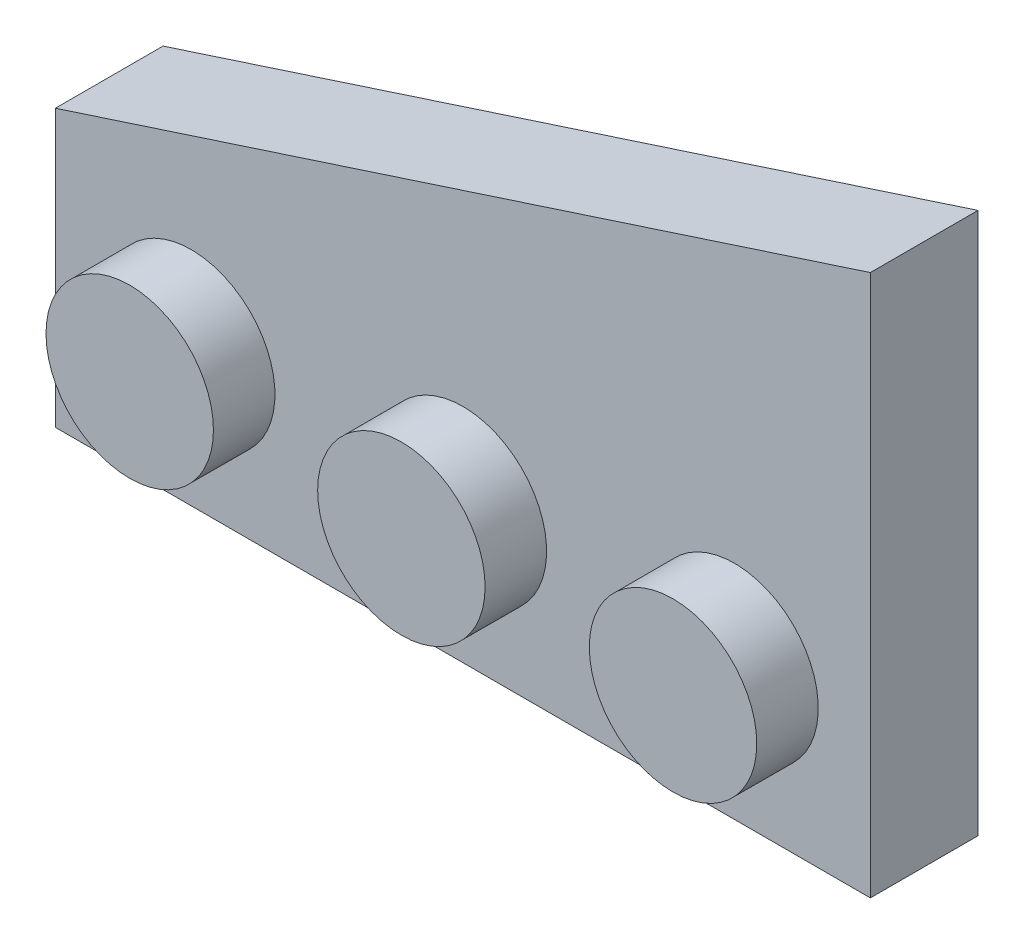
ISO-10303-21;
HEADER;
FILE_DESCRIPTION(('STEP AP214'),'2;1');
FILE_NAME('part.step','',(''),(''),'','','');
FILE_SCHEMA(('AUTOMOTIVE_DESIGN { 1 0 10303 214 1 1 1 1 }'));
ENDSEC;
DATA;
#1=APPLICATION_CONTEXT('core data for automotive mechanical design processes');
#2=APPLICATION_PROTOCOL_DEFINITION('international standard','automotive_design',2000,#1);
#3=PRODUCT_CONTEXT('',#1,'mechanical');
#4=PRODUCT('Part','Part','',(#3));
#5=PRODUCT_RELATED_PRODUCT_CATEGORY('part','',(#4));
#6=PRODUCT_DEFINITION_FORMATION('','',#4);
#7=PRODUCT_DEFINITION_CONTEXT('part definition',#1,'design');
#8=PRODUCT_DEFINITION('design','',#6,#7);
#9=PRODUCT_DEFINITION_SHAPE('','',#8);
#10=(LENGTH_UNIT() NAMED_UNIT(*) SI_UNIT(.MILLI.,.METRE.));
#11=(NAMED_UNIT(*) PLANE_ANGLE_UNIT() SI_UNIT($,.RADIAN.));
#12=(NAMED_UNIT(*) SI_UNIT($,.STERADIAN.) SOLID_ANGLE_UNIT());
#13=UNCERTAINTY_MEASURE_WITH_UNIT(LENGTH_MEASURE(1.E-05),#10,'distance_accuracy_value','');
#14=(GEOMETRIC_REPRESENTATION_CONTEXT(3) GLOBAL_UNCERTAINTY_ASSIGNED_CONTEXT((#13)) GLOBAL_UNIT_ASSIGNED_CONTEXT((#10,
#11,#12)) REPRESENTATION_CONTEXT('',''));
#15=CARTESIAN_POINT('',(0.,0.,0.));
#16=DIRECTION('',(0.,0.,1.));
#17=DIRECTION('',(1.,0.,0.));
#18=AXIS2_PLACEMENT_3D('',#15,#16,#17);
#19=CARTESIAN_POINT('',(0.,0.,-3.15));
#20=DIRECTION('',(0.,0.,-1.));
#21=DIRECTION('',(-1.,0.,0.));
#22=AXIS2_PLACEMENT_3D('',#19,#20,#21);
#23=PLANE('',#22);
#24=DIRECTION('',(-0.950931464321249,-0.309401600131358,0.));
#25=VECTOR('',#24,1.);
#26=CARTESIAN_POINT('',(-23.85,8.09,-3.15));
#27=LINE('',#26,#25);
#28=CARTESIAN_POINT('',(0.,15.85,-3.15));
#29=VERTEX_POINT('',#28);
#30=CARTESIAN_POINT('',(-23.85,8.09,-3.15));
#31=VERTEX_POINT('',#30);
#32=EDGE_CURVE('E175',#29,#31,#27,.T.);
#33=ORIENTED_EDGE('',*,*,#32,.F.);
#34=DIRECTION('',(0.,1.,0.));
#35=VECTOR('',#34,1.);
#36=CARTESIAN_POINT('',(0.,15.85,-3.15));
#37=LINE('',#36,#35);
#38=CARTESIAN_POINT('',(0.,0.,-3.15));
#39=VERTEX_POINT('',#38);
#40=EDGE_CURVE('E183',#39,#29,#37,.T.);
#41=ORIENTED_EDGE('',*,*,#40,.F.);
#42=DIRECTION('',(1.,0.,0.));
#43=VECTOR('',#42,1.);
#44=CARTESIAN_POINT('',(0.,0.,-3.15));
#45=LINE('',#44,#43);
#46=CARTESIAN_POINT('',(-23.85,0.,-3.15));
#47=VERTEX_POINT('',#46);
#48=EDGE_CURVE('E180',#47,#39,#45,.T.);
#49=ORIENTED_EDGE('',*,*,#48,.F.);
#50=DIRECTION('',(0.,-1.,0.));
#51=VECTOR('',#50,1.);
#52=CARTESIAN_POINT('',(-23.85,0.,-3.15));
#53=LINE('',#52,#51);
#54=EDGE_CURVE('E177',#31,#47,#53,.T.);
#55=ORIENTED_EDGE('',*,*,#54,.F.);
#56=EDGE_LOOP('',(#33,#41,#49,#55));
#57=FACE_BOUND('',#56,.T.);
#58=DIRECTION('',(0.,1.,0.));
#59=VECTOR('',#58,1.);
#60=CARTESIAN_POINT('',(-1.5,15.85,-3.15));
#61=LINE('',#60,#59);
#62=CARTESIAN_POINT('',(-1.5,1.5,-3.15));
#63=VERTEX_POINT('',#62);
#64=CARTESIAN_POINT('',(-1.5,13.7845489408125,-3.15));
#65=VERTEX_POINT('',#64);
#66=EDGE_CURVE('E161',#63,#65,#61,.T.);
#67=ORIENTED_EDGE('',*,*,#66,.T.);
#68=DIRECTION('',(-0.950931464321249,-0.309401600131358,0.));
#69=VECTOR('',#68,1.);
#70=CARTESIAN_POINT('',(-23.385897599803,6.66360280351812,-3.15));
#71=LINE('',#70,#69);
#72=CARTESIAN_POINT('',(-22.35,7.00064956974332,-3.15));
#73=VERTEX_POINT('',#72);
#74=EDGE_CURVE('E112',#65,#73,#71,.T.);
#75=ORIENTED_EDGE('',*,*,#74,.T.);
#76=DIRECTION('',(0.,-1.,0.));
#77=VECTOR('',#76,1.);
#78=CARTESIAN_POINT('',(-22.35,0.,-3.15));
#79=LINE('',#78,#77);
#80=CARTESIAN_POINT('',(-22.35,1.5,-3.15));
#81=VERTEX_POINT('',#80);
#82=EDGE_CURVE('E134',#73,#81,#79,.T.);
#83=ORIENTED_EDGE('',*,*,#82,.T.);
#84=DIRECTION('',(1.,0.,0.));
#85=VECTOR('',#84,1.);
#86=CARTESIAN_POINT('',(0.,1.5,-3.15));
#87=LINE('',#86,#85);
#88=EDGE_CURVE('E48',#81,#63,#87,.T.);
#89=ORIENTED_EDGE('',*,*,#88,.T.);
#90=EDGE_LOOP('',(#67,#75,#83,#89));
#91=FACE_BOUND('',#90,.T.);
#92=ADVANCED_FACE('F33',(#57,#91),#23,.T.);
#93=CARTESIAN_POINT('',(-23.85,8.09,-3.15));
#94=DIRECTION('',(-0.309401600131358,0.950931464321249,0.));
#95=DIRECTION('',(-0.950931464321249,-0.309401600131358,0.));
#96=AXIS2_PLACEMENT_3D('',#93,#94,#95);
#97=PLANE('',#96);
#98=DIRECTION('',(-0.950931464321249,-0.309401600131358,0.));
#99=VECTOR('',#98,1.);
#100=CARTESIAN_POINT('',(-23.85,8.09,0.));
#101=LINE('',#100,#99);
#102=CARTESIAN_POINT('',(0.,15.85,0.));
#103=VERTEX_POINT('',#102);
#104=CARTESIAN_POINT('',(-23.85,8.09,0.));
#105=VERTEX_POINT('',#104);
#106=EDGE_CURVE('E174',#103,#105,#101,.T.);
#107=ORIENTED_EDGE('',*,*,#106,.F.);
#108=DIRECTION('',(0.,0.,1.));
#109=VECTOR('',#108,1.);
#110=CARTESIAN_POINT('',(0.,15.85,-3.15));
#111=LINE('',#110,#109);
#112=EDGE_CURVE('E57',#29,#103,#111,.T.);
#113=ORIENTED_EDGE('',*,*,#112,.F.);
#114=ORIENTED_EDGE('',*,*,#32,.T.);
#115=DIRECTION('',(0.,0.,1.));
#116=VECTOR('',#115,1.);
#117=CARTESIAN_POINT('',(-23.85,8.09,-3.15));
#118=LINE('',#117,#116);
#119=EDGE_CURVE('E83',#31,#105,#118,.T.);
#120=ORIENTED_EDGE('',*,*,#119,.T.);
#121=EDGE_LOOP('',(#107,#113,#114,#120));
#122=FACE_BOUND('',#121,.T.);
#123=ADVANCED_FACE('F35',(#122),#97,.T.);
#124=CARTESIAN_POINT('',(0.,15.85,-3.15));
#125=DIRECTION('',(1.,0.,0.));
#126=DIRECTION('',(0.,1.,0.));
#127=AXIS2_PLACEMENT_3D('',#124,#125,#126);
#128=PLANE('',#127);
#129=DIRECTION('',(0.,1.,0.));
#130=VECTOR('',#129,1.);
#131=CARTESIAN_POINT('',(0.,15.85,0.));
#132=LINE('',#131,#130);
#133=CARTESIAN_POINT('',(0.,0.,0.));
#134=VERTEX_POINT('',#133);
#135=EDGE_CURVE('E178',#134,#103,#132,.T.);
#136=ORIENTED_EDGE('',*,*,#135,.F.);
#137=DIRECTION('',(0.,0.,1.));
#138=VECTOR('',#137,1.);
#139=CARTESIAN_POINT('',(0.,0.,-3.15));
#140=LINE('',#139,#138);
#141=EDGE_CURVE('E197',#39,#134,#140,.T.);
#142=ORIENTED_EDGE('',*,*,#141,.F.);
#143=ORIENTED_EDGE('',*,*,#40,.T.);
#144=ORIENTED_EDGE('',*,*,#112,.T.);
#145=EDGE_LOOP('',(#136,#142,#143,#144));
#146=FACE_BOUND('',#145,.T.);
#147=ADVANCED_FACE('F221',(#146),#128,.T.);
#148=CARTESIAN_POINT('',(0.,0.,-3.15));
#149=DIRECTION('',(0.,-1.,0.));
#150=DIRECTION('',(0.,0.,-1.));
#151=AXIS2_PLACEMENT_3D('',#148,#149,#150);
#152=PLANE('',#151);
#153=DIRECTION('',(1.,0.,0.));
#154=VECTOR('',#153,1.);
#155=CARTESIAN_POINT('',(0.,0.,0.));
#156=LINE('',#155,#154);
#157=CARTESIAN_POINT('',(-23.85,0.,0.));
#158=VERTEX_POINT('',#157);
#159=EDGE_CURVE('E190',#158,#134,#156,.T.);
#160=ORIENTED_EDGE('',*,*,#159,.F.);
#161=DIRECTION('',(0.,0.,1.));
#162=VECTOR('',#161,1.);
#163=CARTESIAN_POINT('',(-23.85,0.,-3.15));
#164=LINE('',#163,#162);
#165=EDGE_CURVE('E199',#47,#158,#164,.T.);
#166=ORIENTED_EDGE('',*,*,#165,.F.);
#167=ORIENTED_EDGE('',*,*,#48,.T.);
#168=ORIENTED_EDGE('',*,*,#141,.T.);
#169=EDGE_LOOP('',(#160,#166,#167,#168));
#170=FACE_BOUND('',#169,.T.);
#171=ADVANCED_FACE('F220',(#170),#152,.T.);
#172=CARTESIAN_POINT('',(-23.85,0.,-3.15));
#173=DIRECTION('',(-1.,0.,0.));
#174=DIRECTION('',(0.,-1.,0.));
#175=AXIS2_PLACEMENT_3D('',#172,#173,#174);
#176=PLANE('',#175);
#177=DIRECTION('',(0.,-1.,0.));
#178=VECTOR('',#177,1.);
#179=CARTESIAN_POINT('',(-23.85,0.,0.));
#180=LINE('',#179,#178);
#181=EDGE_CURVE('E187',#105,#158,#180,.T.);
#182=ORIENTED_EDGE('',*,*,#181,.F.);
#183=ORIENTED_EDGE('',*,*,#119,.F.);
#184=ORIENTED_EDGE('',*,*,#54,.T.);
#185=ORIENTED_EDGE('',*,*,#165,.T.);
#186=EDGE_LOOP('',(#182,#183,#184,#185));
#187=FACE_BOUND('',#186,.T.);
#188=ADVANCED_FACE('F212',(#187),#176,.T.);
#189=CARTESIAN_POINT('',(0.,0.,0.));
#190=DIRECTION('',(0.,0.,-1.));
#191=DIRECTION('',(-1.,0.,0.));
#192=AXIS2_PLACEMENT_3D('',#189,#190,#191);
#193=PLANE('',#192);
#194=CARTESIAN_POINT('',(-19.875,4.04499999999989,0.));
#195=DIRECTION('',(0.,0.,-1.));
#196=DIRECTION('',(-1.,0.,0.));
#197=AXIS2_PLACEMENT_3D('',#194,#195,#196);
#198=CIRCLE('',#197,2.45);
#199=CARTESIAN_POINT('',(-22.325,4.04499999999989,0.));
#200=VERTEX_POINT('',#199);
#201=EDGE_CURVE('E11',#200,#200,#198,.F.);
#202=ORIENTED_EDGE('',*,*,#201,.F.);
#203=EDGE_LOOP('',(#202));
#204=FACE_BOUND('',#203,.T.);
#205=CARTESIAN_POINT('',(-11.925,4.04499999999994,0.));
#206=DIRECTION('',(0.,0.,-1.));
#207=DIRECTION('',(-1.,0.,0.));
#208=AXIS2_PLACEMENT_3D('',#205,#206,#207);
#209=CIRCLE('',#208,2.45);
#210=CARTESIAN_POINT('',(-14.375,4.04499999999994,0.));
#211=VERTEX_POINT('',#210);
#212=EDGE_CURVE('E41',#211,#211,#209,.F.);
#213=ORIENTED_EDGE('',*,*,#212,.F.);
#214=EDGE_LOOP('',(#213));
#215=FACE_BOUND('',#214,.T.);
#216=CARTESIAN_POINT('',(-3.975,4.045,0.));
#217=DIRECTION('',(0.,0.,-1.));
#218=DIRECTION('',(-1.,0.,0.));
#219=AXIS2_PLACEMENT_3D('',#216,#217,#218);
#220=CIRCLE('',#219,2.45);
#221=CARTESIAN_POINT('',(-6.425,4.045,0.));
#222=VERTEX_POINT('',#221);
#223=EDGE_CURVE('E196',#222,#222,#220,.F.);
#224=ORIENTED_EDGE('',*,*,#223,.F.);
#225=EDGE_LOOP('',(#224));
#226=FACE_BOUND('',#225,.T.);
#227=ORIENTED_EDGE('',*,*,#106,.T.);
#228=ORIENTED_EDGE('',*,*,#181,.T.);
#229=ORIENTED_EDGE('',*,*,#159,.T.);
#230=ORIENTED_EDGE('',*,*,#135,.T.);
#231=EDGE_LOOP('',(#227,#228,#229,#230));
#232=FACE_BOUND('',#231,.T.);
#233=ADVANCED_FACE('F208',(#204,#215,#226,#232),#193,.F.);
#234=CARTESIAN_POINT('',(-3.975,4.045,1.8));
#235=DIRECTION('',(0.,0.,-1.));
#236=DIRECTION('',(-1.,0.,0.));
#237=AXIS2_PLACEMENT_3D('',#234,#235,#236);
#238=CYLINDRICAL_SURFACE('',#237,2.45);
#239=CARTESIAN_POINT('',(-3.975,4.045,1.8));
#240=DIRECTION('',(0.,0.,1.));
#241=DIRECTION('',(1.,0.,0.));
#242=AXIS2_PLACEMENT_3D('',#239,#240,#241);
#243=CIRCLE('',#242,2.45);
#244=CARTESIAN_POINT('',(-1.525,4.045,1.8));
#245=VERTEX_POINT('',#244);
#246=EDGE_CURVE('E171',#245,#245,#243,.T.);
#247=ORIENTED_EDGE('',*,*,#246,.F.);
#248=EDGE_LOOP('',(#247));
#249=FACE_BOUND('',#248,.T.);
#250=ORIENTED_EDGE('',*,*,#223,.T.);
#251=EDGE_LOOP('',(#250));
#252=FACE_BOUND('',#251,.T.);
#253=ADVANCED_FACE('F211',(#249,#252),#238,.T.);
#254=CARTESIAN_POINT('',(-3.975,4.045,1.8));
#255=DIRECTION('',(0.,0.,1.));
#256=DIRECTION('',(1.,0.,0.));
#257=AXIS2_PLACEMENT_3D('',#254,#255,#256);
#258=PLANE('',#257);
#259=ORIENTED_EDGE('',*,*,#246,.T.);
#260=EDGE_LOOP('',(#259));
#261=FACE_BOUND('',#260,.T.);
#262=ADVANCED_FACE('F282',(#261),#258,.T.);
#263=CARTESIAN_POINT('',(-11.925,4.04499999999994,1.8));
#264=DIRECTION('',(0.,0.,-1.));
#265=DIRECTION('',(-1.,0.,0.));
#266=AXIS2_PLACEMENT_3D('',#263,#264,#265);
#267=CYLINDRICAL_SURFACE('',#266,2.45);
#268=CARTESIAN_POINT('',(-11.925,4.04499999999994,1.8));
#269=DIRECTION('',(0.,0.,1.));
#270=DIRECTION('',(1.,0.,0.));
#271=AXIS2_PLACEMENT_3D('',#268,#269,#270);
#272=CIRCLE('',#271,2.45);
#273=CARTESIAN_POINT('',(-9.475,4.04499999999994,1.8));
#274=VERTEX_POINT('',#273);
#275=EDGE_CURVE('E168',#274,#274,#272,.T.);
#276=ORIENTED_EDGE('',*,*,#275,.F.);
#277=EDGE_LOOP('',(#276));
#278=FACE_BOUND('',#277,.T.);
#279=ORIENTED_EDGE('',*,*,#212,.T.);
#280=EDGE_LOOP('',(#279));
#281=FACE_BOUND('',#280,.T.);
#282=ADVANCED_FACE('F206',(#278,#281),#267,.T.);
#283=CARTESIAN_POINT('',(-11.925,4.04499999999994,1.8));
#284=DIRECTION('',(0.,0.,1.));
#285=DIRECTION('',(1.,0.,0.));
#286=AXIS2_PLACEMENT_3D('',#283,#284,#285);
#287=PLANE('',#286);
#288=ORIENTED_EDGE('',*,*,#275,.T.);
#289=EDGE_LOOP('',(#288));
#290=FACE_BOUND('',#289,.T.);
#291=ADVANCED_FACE('F275',(#290),#287,.T.);
#292=CARTESIAN_POINT('',(-19.875,4.04499999999989,1.8));
#293=DIRECTION('',(0.,0.,-1.));
#294=DIRECTION('',(-1.,0.,0.));
#295=AXIS2_PLACEMENT_3D('',#292,#293,#294);
#296=CYLINDRICAL_SURFACE('',#295,2.45);
#297=CARTESIAN_POINT('',(-19.875,4.04499999999989,1.8));
#298=DIRECTION('',(0.,0.,1.));
#299=DIRECTION('',(1.,0.,0.));
#300=AXIS2_PLACEMENT_3D('',#297,#298,#299);
#301=CIRCLE('',#300,2.45);
#302=CARTESIAN_POINT('',(-17.425,4.04499999999989,1.8));
#303=VERTEX_POINT('',#302);
#304=EDGE_CURVE('E147',#303,#303,#301,.T.);
#305=ORIENTED_EDGE('',*,*,#304,.F.);
#306=EDGE_LOOP('',(#305));
#307=FACE_BOUND('',#306,.T.);
#308=ORIENTED_EDGE('',*,*,#201,.T.);
#309=EDGE_LOOP('',(#308));
#310=FACE_BOUND('',#309,.T.);
#311=ADVANCED_FACE('F271',(#307,#310),#296,.T.);
#312=CARTESIAN_POINT('',(-19.875,4.04499999999989,1.8));
#313=DIRECTION('',(0.,0.,1.));
#314=DIRECTION('',(1.,0.,0.));
#315=AXIS2_PLACEMENT_3D('',#312,#313,#314);
#316=PLANE('',#315);
#317=ORIENTED_EDGE('',*,*,#304,.T.);
#318=EDGE_LOOP('',(#317));
#319=FACE_BOUND('',#318,.T.);
#320=ADVANCED_FACE('F268',(#319),#316,.T.);
#321=CARTESIAN_POINT('',(-23.385897599803,6.66360280351812,-3.15));
#322=DIRECTION('',(-0.309401600131358,0.950931464321249,0.));
#323=DIRECTION('',(-0.950931464321249,-0.309401600131358,0.));
#324=AXIS2_PLACEMENT_3D('',#321,#322,#323);
#325=PLANE('',#324);
#326=DIRECTION('',(-0.950931464321249,-0.309401600131358,0.));
#327=VECTOR('',#326,1.);
#328=CARTESIAN_POINT('',(-23.385897599803,6.66360280351812,-1.5));
#329=LINE('',#328,#327);
#330=CARTESIAN_POINT('',(-1.5,13.7845489408125,-1.5));
#331=VERTEX_POINT('',#330);
#332=CARTESIAN_POINT('',(-22.35,7.00064956974332,-1.5));
#333=VERTEX_POINT('',#332);
#334=EDGE_CURVE('E110',#331,#333,#329,.T.);
#335=ORIENTED_EDGE('',*,*,#334,.T.);
#336=DIRECTION('',(0.,0.,1.));
#337=VECTOR('',#336,1.);
#338=CARTESIAN_POINT('',(-22.35,7.00064956974332,-3.15));
#339=LINE('',#338,#337);
#340=EDGE_CURVE('E139',#73,#333,#339,.T.);
#341=ORIENTED_EDGE('',*,*,#340,.F.);
#342=ORIENTED_EDGE('',*,*,#74,.F.);
#343=DIRECTION('',(0.,0.,1.));
#344=VECTOR('',#343,1.);
#345=CARTESIAN_POINT('',(-1.5,13.7845489408125,-3.15));
#346=LINE('',#345,#344);
#347=EDGE_CURVE('E107',#65,#331,#346,.T.);
#348=ORIENTED_EDGE('',*,*,#347,.T.);
#349=EDGE_LOOP('',(#335,#341,#342,#348));
#350=FACE_BOUND('',#349,.T.);
#351=ADVANCED_FACE('F109',(#350),#325,.F.);
#352=CARTESIAN_POINT('',(-1.5,15.85,-3.15));
#353=DIRECTION('',(1.,0.,0.));
#354=DIRECTION('',(0.,1.,0.));
#355=AXIS2_PLACEMENT_3D('',#352,#353,#354);
#356=PLANE('',#355);
#357=DIRECTION('',(0.,1.,0.));
#358=VECTOR('',#357,1.);
#359=CARTESIAN_POINT('',(-1.5,15.85,-1.5));
#360=LINE('',#359,#358);
#361=CARTESIAN_POINT('',(-1.5,1.5,-1.5));
#362=VERTEX_POINT('',#361);
#363=EDGE_CURVE('E125',#362,#331,#360,.T.);
#364=ORIENTED_EDGE('',*,*,#363,.T.);
#365=ORIENTED_EDGE('',*,*,#347,.F.);
#366=ORIENTED_EDGE('',*,*,#66,.F.);
#367=DIRECTION('',(0.,0.,1.));
#368=VECTOR('',#367,1.);
#369=CARTESIAN_POINT('',(-1.5,1.5,-3.15));
#370=LINE('',#369,#368);
#371=EDGE_CURVE('E118',#63,#362,#370,.T.);
#372=ORIENTED_EDGE('',*,*,#371,.T.);
#373=EDGE_LOOP('',(#364,#365,#366,#372));
#374=FACE_BOUND('',#373,.T.);
#375=ADVANCED_FACE('F130',(#374),#356,.F.);
#376=CARTESIAN_POINT('',(0.,1.5,-3.15));
#377=DIRECTION('',(0.,-1.,0.));
#378=DIRECTION('',(0.,0.,-1.));
#379=AXIS2_PLACEMENT_3D('',#376,#377,#378);
#380=PLANE('',#379);
#381=DIRECTION('',(1.,0.,0.));
#382=VECTOR('',#381,1.);
#383=CARTESIAN_POINT('',(0.,1.5,-1.5));
#384=LINE('',#383,#382);
#385=CARTESIAN_POINT('',(-22.35,1.5,-1.5));
#386=VERTEX_POINT('',#385);
#387=EDGE_CURVE('E132',#386,#362,#384,.T.);
#388=ORIENTED_EDGE('',*,*,#387,.T.);
#389=ORIENTED_EDGE('',*,*,#371,.F.);
#390=ORIENTED_EDGE('',*,*,#88,.F.);
#391=DIRECTION('',(0.,0.,1.));
#392=VECTOR('',#391,1.);
#393=CARTESIAN_POINT('',(-22.35,1.5,-3.15));
#394=LINE('',#393,#392);
#395=EDGE_CURVE('E140',#81,#386,#394,.T.);
#396=ORIENTED_EDGE('',*,*,#395,.T.);
#397=EDGE_LOOP('',(#388,#389,#390,#396));
#398=FACE_BOUND('',#397,.T.);
#399=ADVANCED_FACE('F230',(#398),#380,.F.);
#400=CARTESIAN_POINT('',(-22.35,0.,-3.15));
#401=DIRECTION('',(-1.,0.,0.));
#402=DIRECTION('',(0.,-1.,0.));
#403=AXIS2_PLACEMENT_3D('',#400,#401,#402);
#404=PLANE('',#403);
#405=DIRECTION('',(0.,-1.,0.));
#406=VECTOR('',#405,1.);
#407=CARTESIAN_POINT('',(-22.35,0.,-1.5));
#408=LINE('',#407,#406);
#409=EDGE_CURVE('E127',#333,#386,#408,.T.);
#410=ORIENTED_EDGE('',*,*,#409,.T.);
#411=ORIENTED_EDGE('',*,*,#395,.F.);
#412=ORIENTED_EDGE('',*,*,#82,.F.);
#413=ORIENTED_EDGE('',*,*,#340,.T.);
#414=EDGE_LOOP('',(#410,#411,#412,#413));
#415=FACE_BOUND('',#414,.T.);
#416=ADVANCED_FACE('F229',(#415),#404,.F.);
#417=CARTESIAN_POINT('',(0.,0.,-1.5));
#418=DIRECTION('',(0.,0.,-1.));
#419=DIRECTION('',(-1.,0.,0.));
#420=AXIS2_PLACEMENT_3D('',#417,#418,#419);
#421=PLANE('',#420);
#422=CARTESIAN_POINT('',(-19.875,4.04499999999989,-1.5));
#423=DIRECTION('',(0.,0.,-1.));
#424=DIRECTION('',(-1.,0.,0.));
#425=AXIS2_PLACEMENT_3D('',#422,#423,#424);
#426=CIRCLE('',#425,0.950000000000002);
#427=CARTESIAN_POINT('',(-20.825,4.04499999999989,-1.5));
#428=VERTEX_POINT('',#427);
#429=EDGE_CURVE('E144',#428,#428,#426,.F.);
#430=ORIENTED_EDGE('',*,*,#429,.T.);
#431=EDGE_LOOP('',(#430));
#432=FACE_BOUND('',#431,.T.);
#433=CARTESIAN_POINT('',(-11.925,4.04499999999994,-1.5));
#434=DIRECTION('',(0.,0.,-1.));
#435=DIRECTION('',(-1.,0.,0.));
#436=AXIS2_PLACEMENT_3D('',#433,#434,#435);
#437=CIRCLE('',#436,0.950000000000002);
#438=CARTESIAN_POINT('',(-12.875,4.04499999999994,-1.5));
#439=VERTEX_POINT('',#438);
#440=EDGE_CURVE('E148',#439,#439,#437,.F.);
#441=ORIENTED_EDGE('',*,*,#440,.T.);
#442=EDGE_LOOP('',(#441));
#443=FACE_BOUND('',#442,.T.);
#444=CARTESIAN_POINT('',(-3.975,4.045,-1.5));
#445=DIRECTION('',(0.,0.,-1.));
#446=DIRECTION('',(-1.,0.,0.));
#447=AXIS2_PLACEMENT_3D('',#444,#445,#446);
#448=CIRCLE('',#447,0.950000000000001);
#449=CARTESIAN_POINT('',(-4.925,4.045,-1.5));
#450=VERTEX_POINT('',#449);
#451=EDGE_CURVE('E117',#450,#450,#448,.F.);
#452=ORIENTED_EDGE('',*,*,#451,.T.);
#453=EDGE_LOOP('',(#452));
#454=FACE_BOUND('',#453,.T.);
#455=ORIENTED_EDGE('',*,*,#334,.F.);
#456=ORIENTED_EDGE('',*,*,#363,.F.);
#457=ORIENTED_EDGE('',*,*,#387,.F.);
#458=ORIENTED_EDGE('',*,*,#409,.F.);
#459=EDGE_LOOP('',(#455,#456,#457,#458));
#460=FACE_BOUND('',#459,.T.);
#461=ADVANCED_FACE('F123',(#432,#443,#454,#460),#421,.T.);
#462=CARTESIAN_POINT('',(-3.975,4.045,1.8));
#463=DIRECTION('',(0.,0.,-1.));
#464=DIRECTION('',(-1.,0.,0.));
#465=AXIS2_PLACEMENT_3D('',#462,#463,#464);
#466=CYLINDRICAL_SURFACE('',#465,0.950000000000001);
#467=CARTESIAN_POINT('',(-3.975,4.045,0.3));
#468=DIRECTION('',(0.,0.,1.));
#469=DIRECTION('',(1.,0.,0.));
#470=AXIS2_PLACEMENT_3D('',#467,#468,#469);
#471=CIRCLE('',#470,0.950000000000001);
#472=CARTESIAN_POINT('',(-3.025,4.045,0.3));
#473=VERTEX_POINT('',#472);
#474=EDGE_CURVE('E128',#473,#473,#471,.T.);
#475=ORIENTED_EDGE('',*,*,#474,.T.);
#476=EDGE_LOOP('',(#475));
#477=FACE_BOUND('',#476,.T.);
#478=ORIENTED_EDGE('',*,*,#451,.F.);
#479=EDGE_LOOP('',(#478));
#480=FACE_BOUND('',#479,.T.);
#481=ADVANCED_FACE('F243',(#477,#480),#466,.F.);
#482=CARTESIAN_POINT('',(-3.975,4.045,0.3));
#483=DIRECTION('',(0.,0.,1.));
#484=DIRECTION('',(1.,0.,0.));
#485=AXIS2_PLACEMENT_3D('',#482,#483,#484);
#486=PLANE('',#485);
#487=ORIENTED_EDGE('',*,*,#474,.F.);
#488=EDGE_LOOP('',(#487));
#489=FACE_BOUND('',#488,.T.);
#490=ADVANCED_FACE('F247',(#489),#486,.F.);
#491=CARTESIAN_POINT('',(-11.925,4.04499999999994,1.8));
#492=DIRECTION('',(0.,0.,-1.));
#493=DIRECTION('',(-1.,0.,0.));
#494=AXIS2_PLACEMENT_3D('',#491,#492,#493);
#495=CYLINDRICAL_SURFACE('',#494,0.950000000000002);
#496=CARTESIAN_POINT('',(-11.925,4.04499999999994,0.3));
#497=DIRECTION('',(0.,0.,1.));
#498=DIRECTION('',(1.,0.,0.));
#499=AXIS2_PLACEMENT_3D('',#496,#497,#498);
#500=CIRCLE('',#499,0.950000000000002);
#501=CARTESIAN_POINT('',(-10.975,4.04499999999994,0.3));
#502=VERTEX_POINT('',#501);
#503=EDGE_CURVE('E155',#502,#502,#500,.T.);
#504=ORIENTED_EDGE('',*,*,#503,.T.);
#505=EDGE_LOOP('',(#504));
#506=FACE_BOUND('',#505,.T.);
#507=ORIENTED_EDGE('',*,*,#440,.F.);
#508=EDGE_LOOP('',(#507));
#509=FACE_BOUND('',#508,.T.);
#510=ADVANCED_FACE('F251',(#506,#509),#495,.F.);
#511=CARTESIAN_POINT('',(-11.925,4.04499999999994,0.3));
#512=DIRECTION('',(0.,0.,1.));
#513=DIRECTION('',(1.,0.,0.));
#514=AXIS2_PLACEMENT_3D('',#511,#512,#513);
#515=PLANE('',#514);
#516=ORIENTED_EDGE('',*,*,#503,.F.);
#517=EDGE_LOOP('',(#516));
#518=FACE_BOUND('',#517,.T.);
#519=ADVANCED_FACE('F255',(#518),#515,.F.);
#520=CARTESIAN_POINT('',(-19.875,4.04499999999989,1.8));
#521=DIRECTION('',(0.,0.,-1.));
#522=DIRECTION('',(-1.,0.,0.));
#523=AXIS2_PLACEMENT_3D('',#520,#521,#522);
#524=CYLINDRICAL_SURFACE('',#523,0.950000000000002);
#525=CARTESIAN_POINT('',(-19.875,4.04499999999989,0.3));
#526=DIRECTION('',(0.,0.,1.));
#527=DIRECTION('',(1.,0.,0.));
#528=AXIS2_PLACEMENT_3D('',#525,#526,#527);
#529=CIRCLE('',#528,0.950000000000002);
#530=CARTESIAN_POINT('',(-18.925,4.04499999999989,0.3));
#531=VERTEX_POINT('',#530);
#532=EDGE_CURVE('E158',#531,#531,#529,.T.);
#533=ORIENTED_EDGE('',*,*,#532,.T.);
#534=EDGE_LOOP('',(#533));
#535=FACE_BOUND('',#534,.T.);
#536=ORIENTED_EDGE('',*,*,#429,.F.);
#537=EDGE_LOOP('',(#536));
#538=FACE_BOUND('',#537,.T.);
#539=ADVANCED_FACE('F259',(#535,#538),#524,.F.);
#540=CARTESIAN_POINT('',(-19.875,4.04499999999989,0.3));
#541=DIRECTION('',(0.,0.,1.));
#542=DIRECTION('',(1.,0.,0.));
#543=AXIS2_PLACEMENT_3D('',#540,#541,#542);
#544=PLANE('',#543);
#545=ORIENTED_EDGE('',*,*,#532,.F.);
#546=EDGE_LOOP('',(#545));
#547=FACE_BOUND('',#546,.T.);
#548=ADVANCED_FACE('F263',(#547),#544,.F.);
#549=CLOSED_SHELL('',(#92,#123,#147,#171,#188,#233,#253,#262,#282,#291,#311,#320,#351,#375,#399,
#416,#461,#481,#490,#510,#519,#539,#548));
#550=MANIFOLD_SOLID_BREP('B2',#549);
#551=ADVANCED_BREP_SHAPE_REPRESENTATION('',(#18,#550),#14);
#552=SHAPE_DEFINITION_REPRESENTATION(#9,#551);
ENDSEC;
END-ISO-10303-21;
